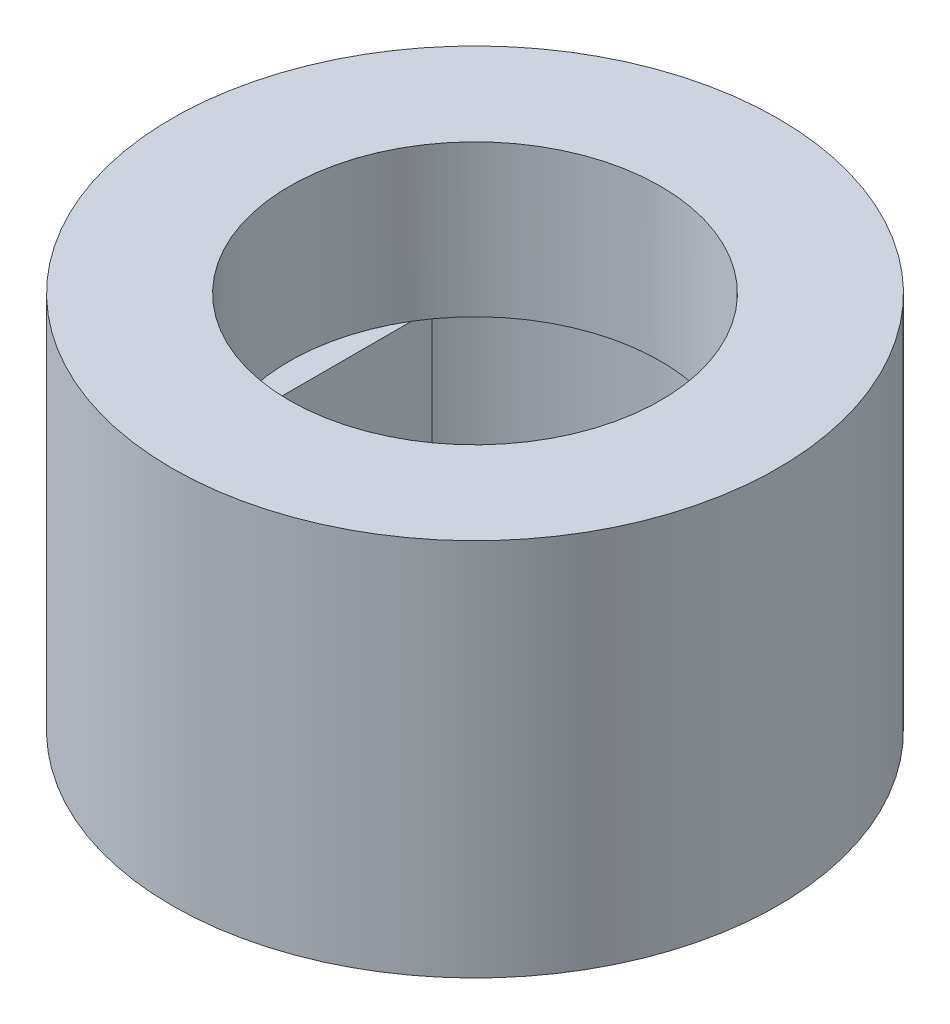
ISO-10303-21;
HEADER;
FILE_DESCRIPTION(('STEP AP214'),'2;1');
FILE_NAME('part.step','',(''),(''),'','','');
FILE_SCHEMA(('AUTOMOTIVE_DESIGN { 1 0 10303 214 1 1 1 1 }'));
ENDSEC;
DATA;
#1=APPLICATION_CONTEXT('core data for automotive mechanical design processes');
#2=APPLICATION_PROTOCOL_DEFINITION('international standard','automotive_design',2000,#1);
#3=PRODUCT_CONTEXT('',#1,'mechanical');
#4=PRODUCT('Part','Part','',(#3));
#5=PRODUCT_RELATED_PRODUCT_CATEGORY('part','',(#4));
#6=PRODUCT_DEFINITION_FORMATION('','',#4);
#7=PRODUCT_DEFINITION_CONTEXT('part definition',#1,'design');
#8=PRODUCT_DEFINITION('design','',#6,#7);
#9=PRODUCT_DEFINITION_SHAPE('','',#8);
#10=(LENGTH_UNIT() NAMED_UNIT(*) SI_UNIT(.MILLI.,.METRE.));
#11=(NAMED_UNIT(*) PLANE_ANGLE_UNIT() SI_UNIT($,.RADIAN.));
#12=(NAMED_UNIT(*) SI_UNIT($,.STERADIAN.) SOLID_ANGLE_UNIT());
#13=UNCERTAINTY_MEASURE_WITH_UNIT(LENGTH_MEASURE(1.E-05),#10,'distance_accuracy_value','');
#14=(GEOMETRIC_REPRESENTATION_CONTEXT(3) GLOBAL_UNCERTAINTY_ASSIGNED_CONTEXT((#13)) GLOBAL_UNIT_ASSIGNED_CONTEXT((#10,
#11,#12)) REPRESENTATION_CONTEXT('',''));
#15=CARTESIAN_POINT('',(0.,0.,0.));
#16=DIRECTION('',(0.,0.,1.));
#17=DIRECTION('',(1.,0.,0.));
#18=AXIS2_PLACEMENT_3D('',#15,#16,#17);
#19=CARTESIAN_POINT('',(0.,0.,0.));
#20=DIRECTION('',(0.,1.,0.));
#21=DIRECTION('',(0.,0.,1.));
#22=AXIS2_PLACEMENT_3D('',#19,#20,#21);
#23=PLANE('',#22);
#24=CARTESIAN_POINT('',(0.,0.,0.));
#25=DIRECTION('',(0.,1.,0.));
#26=DIRECTION('',(0.,0.,1.));
#27=AXIS2_PLACEMENT_3D('',#24,#25,#26);
#28=CIRCLE('',#27,5.08);
#29=CARTESIAN_POINT('',(0.,0.,5.08));
#30=VERTEX_POINT('',#29);
#31=EDGE_CURVE('E43',#30,#30,#28,.T.);
#32=ORIENTED_EDGE('',*,*,#31,.F.);
#33=EDGE_LOOP('',(#32));
#34=FACE_BOUND('',#33,.T.);
#35=CARTESIAN_POINT('',(0.,0.,0.));
#36=DIRECTION('',(0.,1.,0.));
#37=DIRECTION('',(0.,0.,1.));
#38=AXIS2_PLACEMENT_3D('',#35,#36,#37);
#39=CIRCLE('',#38,3.302);
#40=CARTESIAN_POINT('',(-2.667,0.,1.946873134028));
#41=VERTEX_POINT('',#40);
#42=CARTESIAN_POINT('',(-2.667,0.,-1.946873134028));
#43=VERTEX_POINT('',#42);
#44=EDGE_CURVE('E62',#41,#43,#39,.T.);
#45=ORIENTED_EDGE('',*,*,#44,.T.);
#46=DIRECTION('',(0.,0.,-1.));
#47=VECTOR('',#46,1.);
#48=CARTESIAN_POINT('',(-2.667,0.,0.));
#49=LINE('',#48,#47);
#50=EDGE_CURVE('E109',#41,#43,#49,.T.);
#51=ORIENTED_EDGE('',*,*,#50,.F.);
#52=EDGE_LOOP('',(#45,#51));
#53=FACE_BOUND('',#52,.T.);
#54=ADVANCED_FACE('F39',(#34,#53),#23,.F.);
#55=CARTESIAN_POINT('',(0.,6.35,0.));
#56=DIRECTION('',(0.,-1.,0.));
#57=DIRECTION('',(0.,0.,-1.));
#58=AXIS2_PLACEMENT_3D('',#55,#56,#57);
#59=CYLINDRICAL_SURFACE('',#58,5.08);
#60=CARTESIAN_POINT('',(0.,6.35,0.));
#61=DIRECTION('',(0.,1.,0.));
#62=DIRECTION('',(0.,0.,1.));
#63=AXIS2_PLACEMENT_3D('',#60,#61,#62);
#64=CIRCLE('',#63,5.08);
#65=CARTESIAN_POINT('',(0.,6.35,5.08));
#66=VERTEX_POINT('',#65);
#67=EDGE_CURVE('E11',#66,#66,#64,.T.);
#68=ORIENTED_EDGE('',*,*,#67,.F.);
#69=EDGE_LOOP('',(#68));
#70=FACE_BOUND('',#69,.T.);
#71=ORIENTED_EDGE('',*,*,#31,.T.);
#72=EDGE_LOOP('',(#71));
#73=FACE_BOUND('',#72,.T.);
#74=ADVANCED_FACE('F41',(#70,#73),#59,.T.);
#75=CARTESIAN_POINT('',(0.,6.35,0.));
#76=DIRECTION('',(0.,1.,0.));
#77=DIRECTION('',(0.,0.,1.));
#78=AXIS2_PLACEMENT_3D('',#75,#76,#77);
#79=PLANE('',#78);
#80=CARTESIAN_POINT('',(0.,6.35,0.));
#81=DIRECTION('',(0.,1.,0.));
#82=DIRECTION('',(0.,0.,1.));
#83=AXIS2_PLACEMENT_3D('',#80,#81,#82);
#84=CIRCLE('',#83,3.1115);
#85=CARTESIAN_POINT('',(0.,6.35,3.1115));
#86=VERTEX_POINT('',#85);
#87=EDGE_CURVE('E80',#86,#86,#84,.T.);
#88=ORIENTED_EDGE('',*,*,#87,.F.);
#89=EDGE_LOOP('',(#88));
#90=FACE_BOUND('',#89,.T.);
#91=ORIENTED_EDGE('',*,*,#67,.T.);
#92=EDGE_LOOP('',(#91));
#93=FACE_BOUND('',#92,.T.);
#94=ADVANCED_FACE('F117',(#90,#93),#79,.T.);
#95=CARTESIAN_POINT('',(0.,3.81,0.));
#96=DIRECTION('',(0.,-1.,0.));
#97=DIRECTION('',(0.,0.,-1.));
#98=AXIS2_PLACEMENT_3D('',#95,#96,#97);
#99=CYLINDRICAL_SURFACE('',#98,3.302);
#100=ORIENTED_EDGE('',*,*,#44,.F.);
#101=DIRECTION('',(0.,-1.,0.));
#102=VECTOR('',#101,1.);
#103=CARTESIAN_POINT('',(-2.667,3.81,1.946873134028));
#104=LINE('',#103,#102);
#105=CARTESIAN_POINT('',(-2.667,3.81,1.946873134028));
#106=VERTEX_POINT('',#105);
#107=EDGE_CURVE('E101',#106,#41,#104,.T.);
#108=ORIENTED_EDGE('',*,*,#107,.F.);
#109=CARTESIAN_POINT('',(0.,3.81,0.));
#110=DIRECTION('',(0.,1.,0.));
#111=DIRECTION('',(0.,0.,1.));
#112=AXIS2_PLACEMENT_3D('',#109,#110,#111);
#113=CIRCLE('',#112,3.302);
#114=CARTESIAN_POINT('',(-2.667,3.81,-1.946873134028));
#115=VERTEX_POINT('',#114);
#116=EDGE_CURVE('E99',#106,#115,#113,.T.);
#117=ORIENTED_EDGE('',*,*,#116,.T.);
#118=DIRECTION('',(0.,-1.,0.));
#119=VECTOR('',#118,1.);
#120=CARTESIAN_POINT('',(-2.667,3.81,-1.946873134028));
#121=LINE('',#120,#119);
#122=EDGE_CURVE('E103',#115,#43,#121,.T.);
#123=ORIENTED_EDGE('',*,*,#122,.T.);
#124=EDGE_LOOP('',(#100,#108,#117,#123));
#125=FACE_BOUND('',#124,.T.);
#126=ADVANCED_FACE('F120',(#125),#99,.F.);
#127=CARTESIAN_POINT('',(-2.667,3.81,0.));
#128=DIRECTION('',(-1.,0.,0.));
#129=DIRECTION('',(0.,0.,1.));
#130=AXIS2_PLACEMENT_3D('',#127,#128,#129);
#131=PLANE('',#130);
#132=ORIENTED_EDGE('',*,*,#50,.T.);
#133=ORIENTED_EDGE('',*,*,#122,.F.);
#134=DIRECTION('',(0.,0.,-1.));
#135=VECTOR('',#134,1.);
#136=CARTESIAN_POINT('',(-2.667,3.81,0.));
#137=LINE('',#136,#135);
#138=CARTESIAN_POINT('',(-2.667,3.81,-1.60266754194374));
#139=VERTEX_POINT('',#138);
#140=EDGE_CURVE('E93',#139,#115,#137,.T.);
#141=ORIENTED_EDGE('',*,*,#140,.F.);
#142=CARTESIAN_POINT('',(-2.667,3.81,1.60266754194374));
#143=VERTEX_POINT('',#142);
#144=EDGE_CURVE('E85',#143,#139,#137,.T.);
#145=ORIENTED_EDGE('',*,*,#144,.F.);
#146=EDGE_CURVE('E91',#106,#143,#137,.T.);
#147=ORIENTED_EDGE('',*,*,#146,.F.);
#148=ORIENTED_EDGE('',*,*,#107,.T.);
#149=EDGE_LOOP('',(#132,#133,#141,#145,#147,#148));
#150=FACE_BOUND('',#149,.T.);
#151=ADVANCED_FACE('F90',(#150),#131,.F.);
#152=CARTESIAN_POINT('',(0.,3.81,0.));
#153=DIRECTION('',(0.,1.,0.));
#154=DIRECTION('',(0.,0.,1.));
#155=AXIS2_PLACEMENT_3D('',#152,#153,#154);
#156=PLANE('',#155);
#157=ORIENTED_EDGE('',*,*,#146,.T.);
#158=CARTESIAN_POINT('',(0.,3.81,0.));
#159=DIRECTION('',(0.,1.,0.));
#160=DIRECTION('',(0.,0.,1.));
#161=AXIS2_PLACEMENT_3D('',#158,#159,#160);
#162=CIRCLE('',#161,3.1115);
#163=EDGE_CURVE('E73',#143,#139,#162,.T.);
#164=ORIENTED_EDGE('',*,*,#163,.T.);
#165=ORIENTED_EDGE('',*,*,#140,.T.);
#166=ORIENTED_EDGE('',*,*,#116,.F.);
#167=EDGE_LOOP('',(#157,#164,#165,#166));
#168=FACE_BOUND('',#167,.T.);
#169=ADVANCED_FACE('F97',(#168),#156,.F.);
#170=CARTESIAN_POINT('',(0.,3.81,0.));
#171=DIRECTION('',(0.,1.,0.));
#172=DIRECTION('',(0.,0.,1.));
#173=AXIS2_PLACEMENT_3D('',#170,#171,#172);
#174=PLANE('',#173);
#175=ORIENTED_EDGE('',*,*,#144,.T.);
#176=EDGE_CURVE('E54',#139,#143,#162,.T.);
#177=ORIENTED_EDGE('',*,*,#176,.T.);
#178=EDGE_LOOP('',(#175,#177));
#179=FACE_BOUND('',#178,.T.);
#180=ADVANCED_FACE('F84',(#179),#174,.T.);
#181=CARTESIAN_POINT('',(0.,3.81,0.));
#182=DIRECTION('',(0.,1.,0.));
#183=DIRECTION('',(0.,0.,1.));
#184=AXIS2_PLACEMENT_3D('',#181,#182,#183);
#185=CYLINDRICAL_SURFACE('',#184,3.1115);
#186=ORIENTED_EDGE('',*,*,#176,.F.);
#187=ORIENTED_EDGE('',*,*,#163,.F.);
#188=EDGE_LOOP('',(#186,#187));
#189=FACE_BOUND('',#188,.T.);
#190=ORIENTED_EDGE('',*,*,#87,.T.);
#191=EDGE_LOOP('',(#190));
#192=FACE_BOUND('',#191,.T.);
#193=ADVANCED_FACE('F74',(#189,#192),#185,.F.);
#194=CLOSED_SHELL('',(#54,#74,#94,#126,#151,#169,#180,#193));
#195=MANIFOLD_SOLID_BREP('B2',#194);
#196=ADVANCED_BREP_SHAPE_REPRESENTATION('',(#18,#195),#14);
#197=SHAPE_DEFINITION_REPRESENTATION(#9,#196);
ENDSEC;
END-ISO-10303-21;
